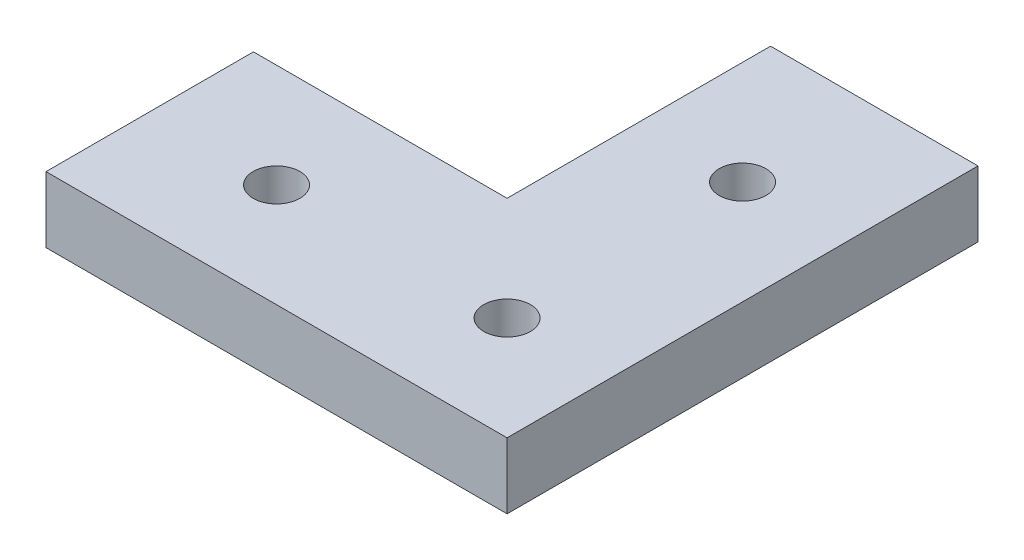
ISO-10303-21;
HEADER;
FILE_DESCRIPTION(('STEP AP214'),'2;1');
FILE_NAME('part.step','',(''),(''),'','','');
FILE_SCHEMA(('AUTOMOTIVE_DESIGN { 1 0 10303 214 1 1 1 1 }'));
ENDSEC;
DATA;
#1=APPLICATION_CONTEXT('core data for automotive mechanical design processes');
#2=APPLICATION_PROTOCOL_DEFINITION('international standard','automotive_design',2000,#1);
#3=PRODUCT_CONTEXT('',#1,'mechanical');
#4=PRODUCT('Part','Part','',(#3));
#5=PRODUCT_RELATED_PRODUCT_CATEGORY('part','',(#4));
#6=PRODUCT_DEFINITION_FORMATION('','',#4);
#7=PRODUCT_DEFINITION_CONTEXT('part definition',#1,'design');
#8=PRODUCT_DEFINITION('design','',#6,#7);
#9=PRODUCT_DEFINITION_SHAPE('','',#8);
#10=(LENGTH_UNIT() NAMED_UNIT(*) SI_UNIT(.MILLI.,.METRE.));
#11=(NAMED_UNIT(*) PLANE_ANGLE_UNIT() SI_UNIT($,.RADIAN.));
#12=(NAMED_UNIT(*) SI_UNIT($,.STERADIAN.) SOLID_ANGLE_UNIT());
#13=UNCERTAINTY_MEASURE_WITH_UNIT(LENGTH_MEASURE(1.E-05),#10,'distance_accuracy_value','');
#14=(GEOMETRIC_REPRESENTATION_CONTEXT(3) GLOBAL_UNCERTAINTY_ASSIGNED_CONTEXT((#13)) GLOBAL_UNIT_ASSIGNED_CONTEXT((#10,
#11,#12)) REPRESENTATION_CONTEXT('',''));
#15=CARTESIAN_POINT('',(0.,0.,0.));
#16=DIRECTION('',(0.,0.,1.));
#17=DIRECTION('',(1.,0.,0.));
#18=AXIS2_PLACEMENT_3D('',#15,#16,#17);
#19=CARTESIAN_POINT('',(24.45,6.35,0.));
#20=DIRECTION('',(-1.,0.,0.));
#21=DIRECTION('',(0.,0.,1.));
#22=AXIS2_PLACEMENT_3D('',#19,#20,#21);
#23=PLANE('',#22);
#24=DIRECTION('',(0.,0.,-1.));
#25=VECTOR('',#24,1.);
#26=CARTESIAN_POINT('',(24.45,0.,0.));
#27=LINE('',#26,#25);
#28=CARTESIAN_POINT('',(24.45,0.,-20.));
#29=VERTEX_POINT('',#28);
#30=CARTESIAN_POINT('',(24.45,0.,-45.4));
#31=VERTEX_POINT('',#30);
#32=EDGE_CURVE('E113',#29,#31,#27,.T.);
#33=ORIENTED_EDGE('',*,*,#32,.F.);
#34=DIRECTION('',(0.,-1.,0.));
#35=VECTOR('',#34,1.);
#36=CARTESIAN_POINT('',(24.45,6.35,-20.));
#37=LINE('',#36,#35);
#38=CARTESIAN_POINT('',(24.45,6.35,-20.));
#39=VERTEX_POINT('',#38);
#40=EDGE_CURVE('E11',#39,#29,#37,.T.);
#41=ORIENTED_EDGE('',*,*,#40,.F.);
#42=DIRECTION('',(0.,0.,-1.));
#43=VECTOR('',#42,1.);
#44=CARTESIAN_POINT('',(24.45,6.35,0.));
#45=LINE('',#44,#43);
#46=CARTESIAN_POINT('',(24.45,6.35,-45.4));
#47=VERTEX_POINT('',#46);
#48=EDGE_CURVE('E127',#39,#47,#45,.T.);
#49=ORIENTED_EDGE('',*,*,#48,.T.);
#50=DIRECTION('',(0.,-1.,0.));
#51=VECTOR('',#50,1.);
#52=CARTESIAN_POINT('',(24.45,6.35,-45.4));
#53=LINE('',#52,#51);
#54=EDGE_CURVE('E78',#47,#31,#53,.T.);
#55=ORIENTED_EDGE('',*,*,#54,.T.);
#56=EDGE_LOOP('',(#33,#41,#49,#55));
#57=FACE_BOUND('',#56,.T.);
#58=ADVANCED_FACE('F33',(#57),#23,.T.);
#59=CARTESIAN_POINT('',(0.,6.35,-20.));
#60=DIRECTION('',(0.,0.,-1.));
#61=DIRECTION('',(-1.,0.,0.));
#62=AXIS2_PLACEMENT_3D('',#59,#60,#61);
#63=PLANE('',#62);
#64=DIRECTION('',(1.,0.,0.));
#65=VECTOR('',#64,1.);
#66=CARTESIAN_POINT('',(0.,0.,-20.));
#67=LINE('',#66,#65);
#68=CARTESIAN_POINT('',(0.,0.,-20.));
#69=VERTEX_POINT('',#68);
#70=EDGE_CURVE('E116',#69,#29,#67,.T.);
#71=ORIENTED_EDGE('',*,*,#70,.F.);
#72=DIRECTION('',(0.,-1.,0.));
#73=VECTOR('',#72,1.);
#74=CARTESIAN_POINT('',(0.,6.35,-20.));
#75=LINE('',#74,#73);
#76=CARTESIAN_POINT('',(0.,6.35,-20.));
#77=VERTEX_POINT('',#76);
#78=EDGE_CURVE('E41',#77,#69,#75,.T.);
#79=ORIENTED_EDGE('',*,*,#78,.F.);
#80=DIRECTION('',(1.,0.,0.));
#81=VECTOR('',#80,1.);
#82=CARTESIAN_POINT('',(0.,6.35,-20.));
#83=LINE('',#82,#81);
#84=EDGE_CURVE('E142',#77,#39,#83,.T.);
#85=ORIENTED_EDGE('',*,*,#84,.T.);
#86=ORIENTED_EDGE('',*,*,#40,.T.);
#87=EDGE_LOOP('',(#71,#79,#85,#86));
#88=FACE_BOUND('',#87,.T.);
#89=ADVANCED_FACE('F136',(#88),#63,.T.);
#90=CARTESIAN_POINT('',(0.,6.35,0.));
#91=DIRECTION('',(-1.,0.,0.));
#92=DIRECTION('',(0.,0.,1.));
#93=AXIS2_PLACEMENT_3D('',#90,#91,#92);
#94=PLANE('',#93);
#95=DIRECTION('',(0.,0.,-1.));
#96=VECTOR('',#95,1.);
#97=CARTESIAN_POINT('',(0.,0.,0.));
#98=LINE('',#97,#96);
#99=CARTESIAN_POINT('',(0.,0.,0.));
#100=VERTEX_POINT('',#99);
#101=EDGE_CURVE('E120',#100,#69,#98,.T.);
#102=ORIENTED_EDGE('',*,*,#101,.F.);
#103=DIRECTION('',(0.,-1.,0.));
#104=VECTOR('',#103,1.);
#105=CARTESIAN_POINT('',(0.,6.35,0.));
#106=LINE('',#105,#104);
#107=CARTESIAN_POINT('',(0.,6.35,0.));
#108=VERTEX_POINT('',#107);
#109=EDGE_CURVE('E105',#108,#100,#106,.T.);
#110=ORIENTED_EDGE('',*,*,#109,.F.);
#111=DIRECTION('',(0.,0.,-1.));
#112=VECTOR('',#111,1.);
#113=CARTESIAN_POINT('',(0.,6.35,0.));
#114=LINE('',#113,#112);
#115=EDGE_CURVE('E98',#108,#77,#114,.T.);
#116=ORIENTED_EDGE('',*,*,#115,.T.);
#117=ORIENTED_EDGE('',*,*,#78,.T.);
#118=EDGE_LOOP('',(#102,#110,#116,#117));
#119=FACE_BOUND('',#118,.T.);
#120=ADVANCED_FACE('F133',(#119),#94,.T.);
#121=CARTESIAN_POINT('',(0.,6.35,0.));
#122=DIRECTION('',(0.,0.,-1.));
#123=DIRECTION('',(-1.,0.,0.));
#124=AXIS2_PLACEMENT_3D('',#121,#122,#123);
#125=PLANE('',#124);
#126=DIRECTION('',(1.,0.,0.));
#127=VECTOR('',#126,1.);
#128=CARTESIAN_POINT('',(0.,0.,0.));
#129=LINE('',#128,#127);
#130=CARTESIAN_POINT('',(44.45,0.,0.));
#131=VERTEX_POINT('',#130);
#132=EDGE_CURVE('E104',#100,#131,#129,.T.);
#133=ORIENTED_EDGE('',*,*,#132,.T.);
#134=DIRECTION('',(0.,-1.,0.));
#135=VECTOR('',#134,1.);
#136=CARTESIAN_POINT('',(44.45,6.35,0.));
#137=LINE('',#136,#135);
#138=CARTESIAN_POINT('',(44.45,6.35,0.));
#139=VERTEX_POINT('',#138);
#140=EDGE_CURVE('E101',#139,#131,#137,.T.);
#141=ORIENTED_EDGE('',*,*,#140,.F.);
#142=DIRECTION('',(1.,0.,0.));
#143=VECTOR('',#142,1.);
#144=CARTESIAN_POINT('',(0.,6.35,0.));
#145=LINE('',#144,#143);
#146=EDGE_CURVE('E91',#108,#139,#145,.T.);
#147=ORIENTED_EDGE('',*,*,#146,.F.);
#148=ORIENTED_EDGE('',*,*,#109,.T.);
#149=EDGE_LOOP('',(#133,#141,#147,#148));
#150=FACE_BOUND('',#149,.T.);
#151=ADVANCED_FACE('F102',(#150),#125,.F.);
#152=CARTESIAN_POINT('',(44.45,6.35,0.));
#153=DIRECTION('',(-1.,0.,0.));
#154=DIRECTION('',(0.,0.,1.));
#155=AXIS2_PLACEMENT_3D('',#152,#153,#154);
#156=PLANE('',#155);
#157=DIRECTION('',(0.,0.,-1.));
#158=VECTOR('',#157,1.);
#159=CARTESIAN_POINT('',(44.45,0.,0.));
#160=LINE('',#159,#158);
#161=CARTESIAN_POINT('',(44.45,0.,-45.4));
#162=VERTEX_POINT('',#161);
#163=EDGE_CURVE('E71',#131,#162,#160,.T.);
#164=ORIENTED_EDGE('',*,*,#163,.T.);
#165=DIRECTION('',(0.,-1.,0.));
#166=VECTOR('',#165,1.);
#167=CARTESIAN_POINT('',(44.45,6.35,-45.4));
#168=LINE('',#167,#166);
#169=CARTESIAN_POINT('',(44.45,6.35,-45.4));
#170=VERTEX_POINT('',#169);
#171=EDGE_CURVE('E106',#170,#162,#168,.T.);
#172=ORIENTED_EDGE('',*,*,#171,.F.);
#173=DIRECTION('',(0.,0.,-1.));
#174=VECTOR('',#173,1.);
#175=CARTESIAN_POINT('',(44.45,6.35,0.));
#176=LINE('',#175,#174);
#177=EDGE_CURVE('E95',#139,#170,#176,.T.);
#178=ORIENTED_EDGE('',*,*,#177,.F.);
#179=ORIENTED_EDGE('',*,*,#140,.T.);
#180=EDGE_LOOP('',(#164,#172,#178,#179));
#181=FACE_BOUND('',#180,.T.);
#182=ADVANCED_FACE('F108',(#181),#156,.F.);
#183=CARTESIAN_POINT('',(0.,6.35,-45.4));
#184=DIRECTION('',(0.,0.,1.));
#185=DIRECTION('',(1.,0.,0.));
#186=AXIS2_PLACEMENT_3D('',#183,#184,#185);
#187=PLANE('',#186);
#188=DIRECTION('',(-1.,0.,0.));
#189=VECTOR('',#188,1.);
#190=CARTESIAN_POINT('',(0.,0.,-45.4));
#191=LINE('',#190,#189);
#192=EDGE_CURVE('E125',#162,#31,#191,.T.);
#193=ORIENTED_EDGE('',*,*,#192,.T.);
#194=ORIENTED_EDGE('',*,*,#54,.F.);
#195=DIRECTION('',(-1.,0.,0.));
#196=VECTOR('',#195,1.);
#197=CARTESIAN_POINT('',(0.,6.35,-45.4));
#198=LINE('',#197,#196);
#199=EDGE_CURVE('E49',#170,#47,#198,.T.);
#200=ORIENTED_EDGE('',*,*,#199,.F.);
#201=ORIENTED_EDGE('',*,*,#171,.T.);
#202=EDGE_LOOP('',(#193,#194,#200,#201));
#203=FACE_BOUND('',#202,.T.);
#204=ADVANCED_FACE('F141',(#203),#187,.F.);
#205=CARTESIAN_POINT('',(0.,6.35,0.));
#206=DIRECTION('',(0.,1.,0.));
#207=DIRECTION('',(0.,0.,1.));
#208=AXIS2_PLACEMENT_3D('',#205,#206,#207);
#209=PLANE('',#208);
#210=CARTESIAN_POINT('',(12.225,6.35,-10.));
#211=DIRECTION('',(0.,1.,0.));
#212=DIRECTION('',(0.,0.,1.));
#213=AXIS2_PLACEMENT_3D('',#210,#211,#212);
#214=CIRCLE('',#213,2.25);
#215=CARTESIAN_POINT('',(12.225,6.35,-7.75));
#216=VERTEX_POINT('',#215);
#217=EDGE_CURVE('E158',#216,#216,#214,.T.);
#218=ORIENTED_EDGE('',*,*,#217,.F.);
#219=EDGE_LOOP('',(#218));
#220=FACE_BOUND('',#219,.T.);
#221=CARTESIAN_POINT('',(34.45,6.35,-10.));
#222=DIRECTION('',(0.,1.,0.));
#223=DIRECTION('',(0.,0.,1.));
#224=AXIS2_PLACEMENT_3D('',#221,#222,#223);
#225=CIRCLE('',#224,2.25);
#226=CARTESIAN_POINT('',(34.45,6.35,-7.75));
#227=VERTEX_POINT('',#226);
#228=EDGE_CURVE('E152',#227,#227,#225,.T.);
#229=ORIENTED_EDGE('',*,*,#228,.F.);
#230=EDGE_LOOP('',(#229));
#231=FACE_BOUND('',#230,.T.);
#232=CARTESIAN_POINT('',(34.45,6.35,-32.7));
#233=DIRECTION('',(0.,1.,0.));
#234=DIRECTION('',(0.,0.,1.));
#235=AXIS2_PLACEMENT_3D('',#232,#233,#234);
#236=CIRCLE('',#235,2.25);
#237=CARTESIAN_POINT('',(34.45,6.35,-30.45));
#238=VERTEX_POINT('',#237);
#239=EDGE_CURVE('E146',#238,#238,#236,.T.);
#240=ORIENTED_EDGE('',*,*,#239,.F.);
#241=EDGE_LOOP('',(#240));
#242=FACE_BOUND('',#241,.T.);
#243=ORIENTED_EDGE('',*,*,#48,.F.);
#244=ORIENTED_EDGE('',*,*,#84,.F.);
#245=ORIENTED_EDGE('',*,*,#115,.F.);
#246=ORIENTED_EDGE('',*,*,#146,.T.);
#247=ORIENTED_EDGE('',*,*,#177,.T.);
#248=ORIENTED_EDGE('',*,*,#199,.T.);
#249=EDGE_LOOP('',(#243,#244,#245,#246,#247,#248));
#250=FACE_BOUND('',#249,.T.);
#251=ADVANCED_FACE('F93',(#220,#231,#242,#250),#209,.T.);
#252=CARTESIAN_POINT('',(0.,0.,0.));
#253=DIRECTION('',(0.,1.,0.));
#254=DIRECTION('',(0.,0.,1.));
#255=AXIS2_PLACEMENT_3D('',#252,#253,#254);
#256=PLANE('',#255);
#257=CARTESIAN_POINT('',(12.225,0.,-10.));
#258=DIRECTION('',(0.,1.,0.));
#259=DIRECTION('',(0.,0.,1.));
#260=AXIS2_PLACEMENT_3D('',#257,#258,#259);
#261=CIRCLE('',#260,2.25);
#262=CARTESIAN_POINT('',(12.225,0.,-7.75));
#263=VERTEX_POINT('',#262);
#264=EDGE_CURVE('E117',#263,#263,#261,.T.);
#265=ORIENTED_EDGE('',*,*,#264,.T.);
#266=EDGE_LOOP('',(#265));
#267=FACE_BOUND('',#266,.T.);
#268=CARTESIAN_POINT('',(34.45,0.,-10.));
#269=DIRECTION('',(0.,1.,0.));
#270=DIRECTION('',(0.,0.,1.));
#271=AXIS2_PLACEMENT_3D('',#268,#269,#270);
#272=CIRCLE('',#271,2.25);
#273=CARTESIAN_POINT('',(34.45,0.,-7.75));
#274=VERTEX_POINT('',#273);
#275=EDGE_CURVE('E155',#274,#274,#272,.T.);
#276=ORIENTED_EDGE('',*,*,#275,.T.);
#277=EDGE_LOOP('',(#276));
#278=FACE_BOUND('',#277,.T.);
#279=CARTESIAN_POINT('',(34.45,0.,-32.7));
#280=DIRECTION('',(0.,1.,0.));
#281=DIRECTION('',(0.,0.,1.));
#282=AXIS2_PLACEMENT_3D('',#279,#280,#281);
#283=CIRCLE('',#282,2.25);
#284=CARTESIAN_POINT('',(34.45,0.,-30.45));
#285=VERTEX_POINT('',#284);
#286=EDGE_CURVE('E149',#285,#285,#283,.T.);
#287=ORIENTED_EDGE('',*,*,#286,.T.);
#288=EDGE_LOOP('',(#287));
#289=FACE_BOUND('',#288,.T.);
#290=ORIENTED_EDGE('',*,*,#32,.T.);
#291=ORIENTED_EDGE('',*,*,#192,.F.);
#292=ORIENTED_EDGE('',*,*,#163,.F.);
#293=ORIENTED_EDGE('',*,*,#132,.F.);
#294=ORIENTED_EDGE('',*,*,#101,.T.);
#295=ORIENTED_EDGE('',*,*,#70,.T.);
#296=EDGE_LOOP('',(#290,#291,#292,#293,#294,#295));
#297=FACE_BOUND('',#296,.T.);
#298=ADVANCED_FACE('F138',(#267,#278,#289,#297),#256,.F.);
#299=CARTESIAN_POINT('',(34.45,0.,-32.7));
#300=DIRECTION('',(0.,1.,0.));
#301=DIRECTION('',(0.,0.,1.));
#302=AXIS2_PLACEMENT_3D('',#299,#300,#301);
#303=CYLINDRICAL_SURFACE('',#302,2.25);
#304=ORIENTED_EDGE('',*,*,#286,.F.);
#305=EDGE_LOOP('',(#304));
#306=FACE_BOUND('',#305,.T.);
#307=ORIENTED_EDGE('',*,*,#239,.T.);
#308=EDGE_LOOP('',(#307));
#309=FACE_BOUND('',#308,.T.);
#310=ADVANCED_FACE('F180',(#306,#309),#303,.F.);
#311=CARTESIAN_POINT('',(34.45,0.,-10.));
#312=DIRECTION('',(0.,1.,0.));
#313=DIRECTION('',(0.,0.,1.));
#314=AXIS2_PLACEMENT_3D('',#311,#312,#313);
#315=CYLINDRICAL_SURFACE('',#314,2.25);
#316=ORIENTED_EDGE('',*,*,#275,.F.);
#317=EDGE_LOOP('',(#316));
#318=FACE_BOUND('',#317,.T.);
#319=ORIENTED_EDGE('',*,*,#228,.T.);
#320=EDGE_LOOP('',(#319));
#321=FACE_BOUND('',#320,.T.);
#322=ADVANCED_FACE('F169',(#318,#321),#315,.F.);
#323=CARTESIAN_POINT('',(12.225,0.,-10.));
#324=DIRECTION('',(0.,1.,0.));
#325=DIRECTION('',(0.,0.,1.));
#326=AXIS2_PLACEMENT_3D('',#323,#324,#325);
#327=CYLINDRICAL_SURFACE('',#326,2.25);
#328=ORIENTED_EDGE('',*,*,#264,.F.);
#329=EDGE_LOOP('',(#328));
#330=FACE_BOUND('',#329,.T.);
#331=ORIENTED_EDGE('',*,*,#217,.T.);
#332=EDGE_LOOP('',(#331));
#333=FACE_BOUND('',#332,.T.);
#334=ADVANCED_FACE('F166',(#330,#333),#327,.F.);
#335=CLOSED_SHELL('',(#58,#89,#120,#151,#182,#204,#251,#298,#310,#322,#334));
#336=MANIFOLD_SOLID_BREP('B2',#335);
#337=ADVANCED_BREP_SHAPE_REPRESENTATION('',(#18,#336),#14);
#338=SHAPE_DEFINITION_REPRESENTATION(#9,#337);
ENDSEC;
END-ISO-10303-21;
